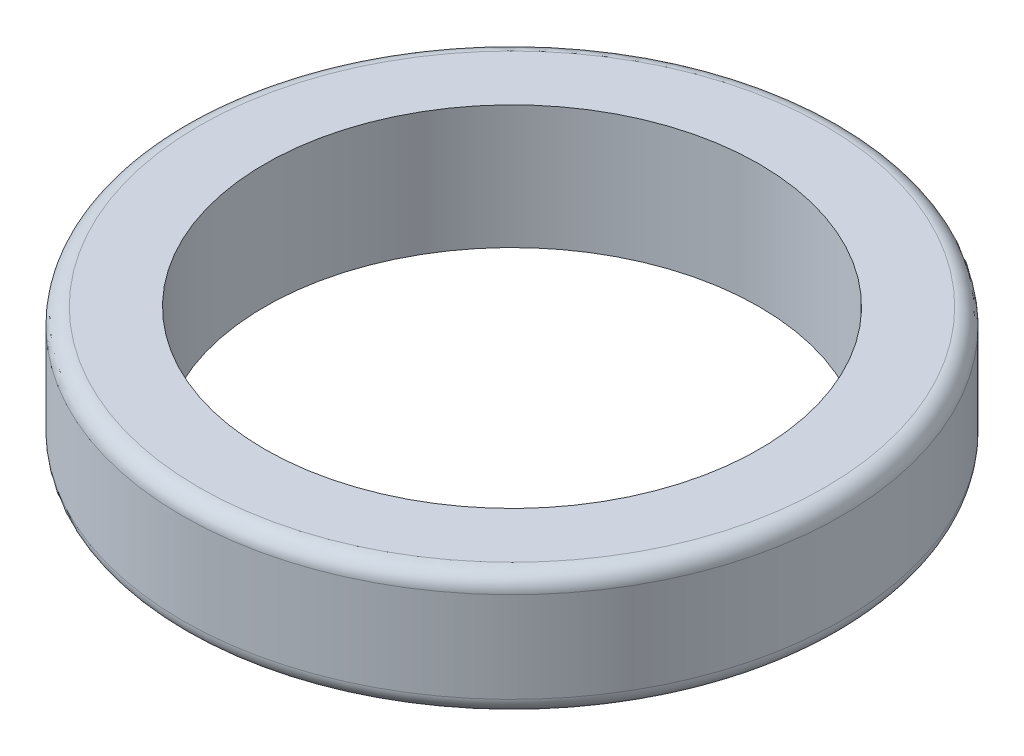
ISO-10303-21;
HEADER;
FILE_DESCRIPTION(('STEP AP214'),'2;1');
FILE_NAME('part.step','',(''),(''),'','','');
FILE_SCHEMA(('AUTOMOTIVE_DESIGN { 1 0 10303 214 1 1 1 1 }'));
ENDSEC;
DATA;
#1=APPLICATION_CONTEXT('core data for automotive mechanical design processes');
#2=APPLICATION_PROTOCOL_DEFINITION('international standard','automotive_design',2000,#1);
#3=PRODUCT_CONTEXT('',#1,'mechanical');
#4=PRODUCT('Part','Part','',(#3));
#5=PRODUCT_RELATED_PRODUCT_CATEGORY('part','',(#4));
#6=PRODUCT_DEFINITION_FORMATION('','',#4);
#7=PRODUCT_DEFINITION_CONTEXT('part definition',#1,'design');
#8=PRODUCT_DEFINITION('design','',#6,#7);
#9=PRODUCT_DEFINITION_SHAPE('','',#8);
#10=(LENGTH_UNIT() NAMED_UNIT(*) SI_UNIT(.MILLI.,.METRE.));
#11=(NAMED_UNIT(*) PLANE_ANGLE_UNIT() SI_UNIT($,.RADIAN.));
#12=(NAMED_UNIT(*) SI_UNIT($,.STERADIAN.) SOLID_ANGLE_UNIT());
#13=UNCERTAINTY_MEASURE_WITH_UNIT(LENGTH_MEASURE(1.E-05),#10,'distance_accuracy_value','');
#14=(GEOMETRIC_REPRESENTATION_CONTEXT(3) GLOBAL_UNCERTAINTY_ASSIGNED_CONTEXT((#13)) GLOBAL_UNIT_ASSIGNED_CONTEXT((#10,
#11,#12)) REPRESENTATION_CONTEXT('',''));
#15=CARTESIAN_POINT('',(0.,0.,0.));
#16=DIRECTION('',(0.,0.,1.));
#17=DIRECTION('',(1.,0.,0.));
#18=AXIS2_PLACEMENT_3D('',#15,#16,#17);
#19=CARTESIAN_POINT('',(0.,1.5,0.));
#20=DIRECTION('',(0.,1.,0.));
#21=DIRECTION('',(0.,0.,1.));
#22=AXIS2_PLACEMENT_3D('',#19,#20,#21);
#23=PLANE('',#22);
#24=CARTESIAN_POINT('',(0.,1.5,0.));
#25=DIRECTION('',(0.,1.,0.));
#26=DIRECTION('',(0.,0.,1.));
#27=AXIS2_PLACEMENT_3D('',#24,#25,#26);
#28=CIRCLE('',#27,3.8);
#29=CARTESIAN_POINT('',(0.,1.5,3.8));
#30=VERTEX_POINT('',#29);
#31=EDGE_CURVE('E10',#30,#30,#28,.T.);
#32=ORIENTED_EDGE('',*,*,#31,.T.);
#33=EDGE_LOOP('',(#32));
#34=FACE_BOUND('',#33,.T.);
#35=CARTESIAN_POINT('',(0.,1.5,0.));
#36=DIRECTION('',(0.,1.,0.));
#37=DIRECTION('',(0.,0.,1.));
#38=AXIS2_PLACEMENT_3D('',#35,#36,#37);
#39=CIRCLE('',#38,3.);
#40=CARTESIAN_POINT('',(0.,1.5,3.));
#41=VERTEX_POINT('',#40);
#42=EDGE_CURVE('E51',#41,#41,#39,.T.);
#43=ORIENTED_EDGE('',*,*,#42,.F.);
#44=EDGE_LOOP('',(#43));
#45=FACE_BOUND('',#44,.T.);
#46=ADVANCED_FACE('F31',(#34,#45),#23,.T.);
#47=CARTESIAN_POINT('',(0.,0.,0.));
#48=DIRECTION('',(0.,1.,0.));
#49=DIRECTION('',(0.,0.,1.));
#50=AXIS2_PLACEMENT_3D('',#47,#48,#49);
#51=PLANE('',#50);
#52=CARTESIAN_POINT('',(0.,0.,0.));
#53=DIRECTION('',(0.,1.,0.));
#54=DIRECTION('',(0.,0.,1.));
#55=AXIS2_PLACEMENT_3D('',#52,#53,#54);
#56=CIRCLE('',#55,3.8);
#57=CARTESIAN_POINT('',(0.,0.,3.8));
#58=VERTEX_POINT('',#57);
#59=EDGE_CURVE('E38',#58,#58,#56,.F.);
#60=ORIENTED_EDGE('',*,*,#59,.T.);
#61=EDGE_LOOP('',(#60));
#62=FACE_BOUND('',#61,.T.);
#63=CARTESIAN_POINT('',(0.,0.,0.));
#64=DIRECTION('',(0.,1.,0.));
#65=DIRECTION('',(0.,0.,1.));
#66=AXIS2_PLACEMENT_3D('',#63,#64,#65);
#67=CIRCLE('',#66,3.);
#68=CARTESIAN_POINT('',(0.,0.,3.));
#69=VERTEX_POINT('',#68);
#70=EDGE_CURVE('E52',#69,#69,#67,.T.);
#71=ORIENTED_EDGE('',*,*,#70,.T.);
#72=EDGE_LOOP('',(#71));
#73=FACE_BOUND('',#72,.T.);
#74=ADVANCED_FACE('F62',(#62,#73),#51,.F.);
#75=CARTESIAN_POINT('',(0.,1.5,0.));
#76=DIRECTION('',(0.,-1.,0.));
#77=DIRECTION('',(0.,0.,-1.));
#78=AXIS2_PLACEMENT_3D('',#75,#76,#77);
#79=CYLINDRICAL_SURFACE('',#78,4.);
#80=CARTESIAN_POINT('',(0.,0.2,0.));
#81=DIRECTION('',(0.,1.,0.));
#82=DIRECTION('',(0.,0.,1.));
#83=AXIS2_PLACEMENT_3D('',#80,#81,#82);
#84=CIRCLE('',#83,4.);
#85=CARTESIAN_POINT('',(0.,0.2,4.));
#86=VERTEX_POINT('',#85);
#87=EDGE_CURVE('E42',#86,#86,#84,.T.);
#88=ORIENTED_EDGE('',*,*,#87,.T.);
#89=EDGE_LOOP('',(#88));
#90=FACE_BOUND('',#89,.T.);
#91=CARTESIAN_POINT('',(0.,1.3,0.));
#92=DIRECTION('',(0.,1.,0.));
#93=DIRECTION('',(0.,0.,1.));
#94=AXIS2_PLACEMENT_3D('',#91,#92,#93);
#95=CIRCLE('',#94,4.);
#96=CARTESIAN_POINT('',(0.,1.3,4.));
#97=VERTEX_POINT('',#96);
#98=EDGE_CURVE('E46',#97,#97,#95,.F.);
#99=ORIENTED_EDGE('',*,*,#98,.T.);
#100=EDGE_LOOP('',(#99));
#101=FACE_BOUND('',#100,.T.);
#102=ADVANCED_FACE('F67',(#90,#101),#79,.T.);
#103=CARTESIAN_POINT('',(0.,1.5,0.));
#104=DIRECTION('',(0.,-1.,0.));
#105=DIRECTION('',(0.,0.,-1.));
#106=AXIS2_PLACEMENT_3D('',#103,#104,#105);
#107=CYLINDRICAL_SURFACE('',#106,3.);
#108=ORIENTED_EDGE('',*,*,#42,.T.);
#109=EDGE_LOOP('',(#108));
#110=FACE_BOUND('',#109,.T.);
#111=ORIENTED_EDGE('',*,*,#70,.F.);
#112=EDGE_LOOP('',(#111));
#113=FACE_BOUND('',#112,.T.);
#114=ADVANCED_FACE('F58',(#110,#113),#107,.F.);
#115=CARTESIAN_POINT('',(0.,0.2,0.));
#116=DIRECTION('',(0.,1.,0.));
#117=DIRECTION('',(0.,0.,1.));
#118=AXIS2_PLACEMENT_3D('',#115,#116,#117);
#119=TOROIDAL_SURFACE('',#118,3.8,0.2);
#120=ORIENTED_EDGE('',*,*,#59,.F.);
#121=EDGE_LOOP('',(#120));
#122=FACE_BOUND('',#121,.T.);
#123=ORIENTED_EDGE('',*,*,#87,.F.);
#124=EDGE_LOOP('',(#123));
#125=FACE_BOUND('',#124,.T.);
#126=ADVANCED_FACE('F73',(#122,#125),#119,.T.);
#127=CARTESIAN_POINT('',(0.,1.3,0.));
#128=DIRECTION('',(0.,1.,0.));
#129=DIRECTION('',(0.,0.,1.));
#130=AXIS2_PLACEMENT_3D('',#127,#128,#129);
#131=TOROIDAL_SURFACE('',#130,3.8,0.2);
#132=ORIENTED_EDGE('',*,*,#98,.F.);
#133=EDGE_LOOP('',(#132));
#134=FACE_BOUND('',#133,.T.);
#135=ORIENTED_EDGE('',*,*,#31,.F.);
#136=EDGE_LOOP('',(#135));
#137=FACE_BOUND('',#136,.T.);
#138=ADVANCED_FACE('F33',(#134,#137),#131,.T.);
#139=CLOSED_SHELL('',(#46,#74,#102,#114,#126,#138));
#140=MANIFOLD_SOLID_BREP('B2',#139);
#141=ADVANCED_BREP_SHAPE_REPRESENTATION('',(#18,#140),#14);
#142=SHAPE_DEFINITION_REPRESENTATION(#9,#141);
ENDSEC;
END-ISO-10303-21;
